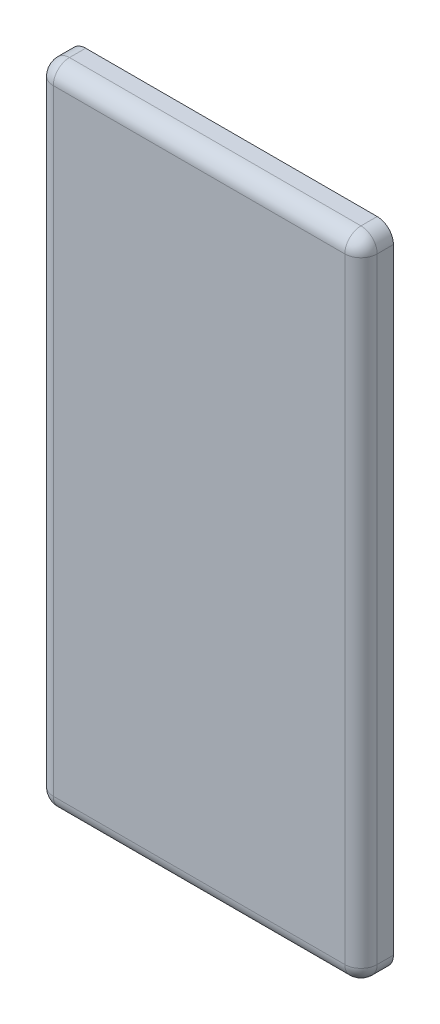
ISO-10303-21;
HEADER;
FILE_DESCRIPTION(('STEP AP214'),'2;1');
FILE_NAME('part.step','',(''),(''),'','','');
FILE_SCHEMA(('AUTOMOTIVE_DESIGN { 1 0 10303 214 1 1 1 1 }'));
ENDSEC;
DATA;
#1=APPLICATION_CONTEXT('core data for automotive mechanical design processes');
#2=APPLICATION_PROTOCOL_DEFINITION('international standard','automotive_design',2000,#1);
#3=PRODUCT_CONTEXT('',#1,'mechanical');
#4=PRODUCT('Part','Part','',(#3));
#5=PRODUCT_RELATED_PRODUCT_CATEGORY('part','',(#4));
#6=PRODUCT_DEFINITION_FORMATION('','',#4);
#7=PRODUCT_DEFINITION_CONTEXT('part definition',#1,'design');
#8=PRODUCT_DEFINITION('design','',#6,#7);
#9=PRODUCT_DEFINITION_SHAPE('','',#8);
#10=(LENGTH_UNIT() NAMED_UNIT(*) SI_UNIT(.MILLI.,.METRE.));
#11=(NAMED_UNIT(*) PLANE_ANGLE_UNIT() SI_UNIT($,.RADIAN.));
#12=(NAMED_UNIT(*) SI_UNIT($,.STERADIAN.) SOLID_ANGLE_UNIT());
#13=UNCERTAINTY_MEASURE_WITH_UNIT(LENGTH_MEASURE(1.E-05),#10,'distance_accuracy_value','');
#14=(GEOMETRIC_REPRESENTATION_CONTEXT(3) GLOBAL_UNCERTAINTY_ASSIGNED_CONTEXT((#13)) GLOBAL_UNIT_ASSIGNED_CONTEXT((#10,
#11,#12)) REPRESENTATION_CONTEXT('',''));
#15=CARTESIAN_POINT('',(0.,0.,0.));
#16=DIRECTION('',(0.,0.,1.));
#17=DIRECTION('',(1.,0.,0.));
#18=AXIS2_PLACEMENT_3D('',#15,#16,#17);
#19=CARTESIAN_POINT('',(10.,-20.,2.));
#20=DIRECTION('',(-1.,0.,0.));
#21=DIRECTION('',(0.,0.,1.));
#22=AXIS2_PLACEMENT_3D('',#19,#20,#21);
#23=PLANE('',#22);
#24=DIRECTION('',(0.,0.,-1.));
#25=VECTOR('',#24,1.);
#26=CARTESIAN_POINT('',(10.,19.,2.));
#27=LINE('',#26,#25);
#28=CARTESIAN_POINT('',(10.,19.,0.));
#29=VERTEX_POINT('',#28);
#30=CARTESIAN_POINT('',(10.,19.,1.));
#31=VERTEX_POINT('',#30);
#32=EDGE_CURVE('E153',#29,#31,#27,.F.);
#33=ORIENTED_EDGE('',*,*,#32,.T.);
#34=DIRECTION('',(0.,1.,0.));
#35=VECTOR('',#34,1.);
#36=CARTESIAN_POINT('',(10.,-20.,1.));
#37=LINE('',#36,#35);
#38=CARTESIAN_POINT('',(10.,-19.,1.));
#39=VERTEX_POINT('',#38);
#40=EDGE_CURVE('E172',#31,#39,#37,.F.);
#41=ORIENTED_EDGE('',*,*,#40,.T.);
#42=DIRECTION('',(0.,0.,-1.));
#43=VECTOR('',#42,1.);
#44=CARTESIAN_POINT('',(10.,-19.,2.));
#45=LINE('',#44,#43);
#46=CARTESIAN_POINT('',(10.,-19.,0.));
#47=VERTEX_POINT('',#46);
#48=EDGE_CURVE('E151',#39,#47,#45,.T.);
#49=ORIENTED_EDGE('',*,*,#48,.T.);
#50=DIRECTION('',(0.,1.,0.));
#51=VECTOR('',#50,1.);
#52=CARTESIAN_POINT('',(10.,-20.,0.));
#53=LINE('',#52,#51);
#54=EDGE_CURVE('E200',#47,#29,#53,.T.);
#55=ORIENTED_EDGE('',*,*,#54,.T.);
#56=EDGE_LOOP('',(#33,#41,#49,#55));
#57=FACE_BOUND('',#56,.T.);
#58=ADVANCED_FACE('F34',(#57),#23,.F.);
#59=CARTESIAN_POINT('',(-10.,20.,2.));
#60=DIRECTION('',(0.,-1.,0.));
#61=DIRECTION('',(0.,0.,-1.));
#62=AXIS2_PLACEMENT_3D('',#59,#60,#61);
#63=PLANE('',#62);
#64=DIRECTION('',(0.,0.,-1.));
#65=VECTOR('',#64,1.);
#66=CARTESIAN_POINT('',(-9.,20.,2.));
#67=LINE('',#66,#65);
#68=CARTESIAN_POINT('',(-9.,20.,0.));
#69=VERTEX_POINT('',#68);
#70=CARTESIAN_POINT('',(-9.,20.,1.));
#71=VERTEX_POINT('',#70);
#72=EDGE_CURVE('E148',#69,#71,#67,.F.);
#73=ORIENTED_EDGE('',*,*,#72,.T.);
#74=DIRECTION('',(-1.,0.,0.));
#75=VECTOR('',#74,1.);
#76=CARTESIAN_POINT('',(-10.,20.,1.));
#77=LINE('',#76,#75);
#78=CARTESIAN_POINT('',(9.,20.,1.));
#79=VERTEX_POINT('',#78);
#80=EDGE_CURVE('E168',#71,#79,#77,.F.);
#81=ORIENTED_EDGE('',*,*,#80,.T.);
#82=DIRECTION('',(0.,0.,-1.));
#83=VECTOR('',#82,1.);
#84=CARTESIAN_POINT('',(9.,20.,2.));
#85=LINE('',#84,#83);
#86=CARTESIAN_POINT('',(9.,20.,0.));
#87=VERTEX_POINT('',#86);
#88=EDGE_CURVE('E146',#79,#87,#85,.T.);
#89=ORIENTED_EDGE('',*,*,#88,.T.);
#90=DIRECTION('',(-1.,0.,0.));
#91=VECTOR('',#90,1.);
#92=CARTESIAN_POINT('',(-10.,20.,0.));
#93=LINE('',#92,#91);
#94=EDGE_CURVE('E136',#87,#69,#93,.T.);
#95=ORIENTED_EDGE('',*,*,#94,.T.);
#96=EDGE_LOOP('',(#73,#81,#89,#95));
#97=FACE_BOUND('',#96,.T.);
#98=ADVANCED_FACE('F212',(#97),#63,.F.);
#99=CARTESIAN_POINT('',(-10.,-20.,2.));
#100=DIRECTION('',(1.,0.,0.));
#101=DIRECTION('',(0.,0.,-1.));
#102=AXIS2_PLACEMENT_3D('',#99,#100,#101);
#103=PLANE('',#102);
#104=DIRECTION('',(0.,0.,-1.));
#105=VECTOR('',#104,1.);
#106=CARTESIAN_POINT('',(-10.,-19.,2.));
#107=LINE('',#106,#105);
#108=CARTESIAN_POINT('',(-10.,-19.,0.));
#109=VERTEX_POINT('',#108);
#110=CARTESIAN_POINT('',(-10.,-19.,1.));
#111=VERTEX_POINT('',#110);
#112=EDGE_CURVE('E123',#109,#111,#107,.F.);
#113=ORIENTED_EDGE('',*,*,#112,.T.);
#114=DIRECTION('',(0.,-1.,0.));
#115=VECTOR('',#114,1.);
#116=CARTESIAN_POINT('',(-10.,-20.,1.));
#117=LINE('',#116,#115);
#118=CARTESIAN_POINT('',(-10.,19.,1.));
#119=VERTEX_POINT('',#118);
#120=EDGE_CURVE('E11',#111,#119,#117,.F.);
#121=ORIENTED_EDGE('',*,*,#120,.T.);
#122=DIRECTION('',(0.,0.,-1.));
#123=VECTOR('',#122,1.);
#124=CARTESIAN_POINT('',(-10.,19.,2.));
#125=LINE('',#124,#123);
#126=CARTESIAN_POINT('',(-10.,19.,0.));
#127=VERTEX_POINT('',#126);
#128=EDGE_CURVE('E127',#119,#127,#125,.T.);
#129=ORIENTED_EDGE('',*,*,#128,.T.);
#130=DIRECTION('',(0.,-1.,0.));
#131=VECTOR('',#130,1.);
#132=CARTESIAN_POINT('',(-10.,-20.,0.));
#133=LINE('',#132,#131);
#134=EDGE_CURVE('E133',#127,#109,#133,.T.);
#135=ORIENTED_EDGE('',*,*,#134,.T.);
#136=EDGE_LOOP('',(#113,#121,#129,#135));
#137=FACE_BOUND('',#136,.T.);
#138=ADVANCED_FACE('F264',(#137),#103,.F.);
#139=CARTESIAN_POINT('',(-10.,-20.,2.));
#140=DIRECTION('',(0.,1.,0.));
#141=DIRECTION('',(0.,0.,1.));
#142=AXIS2_PLACEMENT_3D('',#139,#140,#141);
#143=PLANE('',#142);
#144=DIRECTION('',(0.,0.,-1.));
#145=VECTOR('',#144,1.);
#146=CARTESIAN_POINT('',(9.,-20.,2.));
#147=LINE('',#146,#145);
#148=CARTESIAN_POINT('',(9.,-20.,0.));
#149=VERTEX_POINT('',#148);
#150=CARTESIAN_POINT('',(9.,-20.,1.));
#151=VERTEX_POINT('',#150);
#152=EDGE_CURVE('E119',#149,#151,#147,.F.);
#153=ORIENTED_EDGE('',*,*,#152,.T.);
#154=DIRECTION('',(1.,0.,0.));
#155=VECTOR('',#154,1.);
#156=CARTESIAN_POINT('',(-10.,-20.,1.));
#157=LINE('',#156,#155);
#158=CARTESIAN_POINT('',(-9.,-20.,1.));
#159=VERTEX_POINT('',#158);
#160=EDGE_CURVE('E58',#151,#159,#157,.F.);
#161=ORIENTED_EDGE('',*,*,#160,.T.);
#162=DIRECTION('',(0.,0.,-1.));
#163=VECTOR('',#162,1.);
#164=CARTESIAN_POINT('',(-9.,-20.,2.));
#165=LINE('',#164,#163);
#166=CARTESIAN_POINT('',(-9.,-20.,0.));
#167=VERTEX_POINT('',#166);
#168=EDGE_CURVE('E111',#159,#167,#165,.T.);
#169=ORIENTED_EDGE('',*,*,#168,.T.);
#170=DIRECTION('',(1.,0.,0.));
#171=VECTOR('',#170,1.);
#172=CARTESIAN_POINT('',(-10.,-20.,0.));
#173=LINE('',#172,#171);
#174=EDGE_CURVE('E115',#167,#149,#173,.T.);
#175=ORIENTED_EDGE('',*,*,#174,.T.);
#176=EDGE_LOOP('',(#153,#161,#169,#175));
#177=FACE_BOUND('',#176,.T.);
#178=ADVANCED_FACE('F113',(#177),#143,.F.);
#179=CARTESIAN_POINT('',(0.,0.,2.));
#180=DIRECTION('',(0.,0.,-1.));
#181=DIRECTION('',(-1.,0.,0.));
#182=AXIS2_PLACEMENT_3D('',#179,#180,#181);
#183=PLANE('',#182);
#184=DIRECTION('',(0.,1.,0.));
#185=VECTOR('',#184,1.);
#186=CARTESIAN_POINT('',(9.00000000000001,0.,2.));
#187=LINE('',#186,#185);
#188=CARTESIAN_POINT('',(9.00000000000001,-19.,2.));
#189=VERTEX_POINT('',#188);
#190=CARTESIAN_POINT('',(9.00000000000001,19.,2.));
#191=VERTEX_POINT('',#190);
#192=EDGE_CURVE('E163',#189,#191,#187,.T.);
#193=ORIENTED_EDGE('',*,*,#192,.T.);
#194=DIRECTION('',(-1.,0.,0.));
#195=VECTOR('',#194,1.);
#196=CARTESIAN_POINT('',(0.,19.,2.));
#197=LINE('',#196,#195);
#198=CARTESIAN_POINT('',(-9.,19.,2.));
#199=VERTEX_POINT('',#198);
#200=EDGE_CURVE('E165',#191,#199,#197,.T.);
#201=ORIENTED_EDGE('',*,*,#200,.T.);
#202=DIRECTION('',(0.,-1.,0.));
#203=VECTOR('',#202,1.);
#204=CARTESIAN_POINT('',(-9.,0.,2.));
#205=LINE('',#204,#203);
#206=CARTESIAN_POINT('',(-9.,-19.,2.));
#207=VERTEX_POINT('',#206);
#208=EDGE_CURVE('E159',#199,#207,#205,.T.);
#209=ORIENTED_EDGE('',*,*,#208,.T.);
#210=DIRECTION('',(1.,0.,0.));
#211=VECTOR('',#210,1.);
#212=CARTESIAN_POINT('',(0.,-19.,2.));
#213=LINE('',#212,#211);
#214=EDGE_CURVE('E161',#207,#189,#213,.T.);
#215=ORIENTED_EDGE('',*,*,#214,.T.);
#216=EDGE_LOOP('',(#193,#201,#209,#215));
#217=FACE_BOUND('',#216,.T.);
#218=ADVANCED_FACE('F232',(#217),#183,.F.);
#219=CARTESIAN_POINT('',(0.,0.,0.));
#220=DIRECTION('',(0.,0.,-1.));
#221=DIRECTION('',(-1.,0.,0.));
#222=AXIS2_PLACEMENT_3D('',#219,#220,#221);
#223=PLANE('',#222);
#224=ORIENTED_EDGE('',*,*,#174,.F.);
#225=CARTESIAN_POINT('',(-9.,-19.,0.));
#226=DIRECTION('',(0.,0.,-1.));
#227=DIRECTION('',(-1.,0.,0.));
#228=AXIS2_PLACEMENT_3D('',#225,#226,#227);
#229=CIRCLE('',#228,1.);
#230=EDGE_CURVE('E121',#167,#109,#229,.T.);
#231=ORIENTED_EDGE('',*,*,#230,.T.);
#232=ORIENTED_EDGE('',*,*,#134,.F.);
#233=CARTESIAN_POINT('',(-9.,19.,0.));
#234=DIRECTION('',(0.,0.,-1.));
#235=DIRECTION('',(-1.,0.,0.));
#236=AXIS2_PLACEMENT_3D('',#233,#234,#235);
#237=CIRCLE('',#236,1.);
#238=EDGE_CURVE('E128',#127,#69,#237,.T.);
#239=ORIENTED_EDGE('',*,*,#238,.T.);
#240=ORIENTED_EDGE('',*,*,#94,.F.);
#241=CARTESIAN_POINT('',(9.,19.,0.));
#242=DIRECTION('',(0.,0.,-1.));
#243=DIRECTION('',(-1.,0.,0.));
#244=AXIS2_PLACEMENT_3D('',#241,#242,#243);
#245=CIRCLE('',#244,1.);
#246=EDGE_CURVE('E141',#87,#29,#245,.T.);
#247=ORIENTED_EDGE('',*,*,#246,.T.);
#248=ORIENTED_EDGE('',*,*,#54,.F.);
#249=CARTESIAN_POINT('',(9.00000000000001,-19.,0.));
#250=DIRECTION('',(0.,0.,-1.));
#251=DIRECTION('',(-1.,0.,0.));
#252=AXIS2_PLACEMENT_3D('',#249,#250,#251);
#253=CIRCLE('',#252,1.);
#254=EDGE_CURVE('E118',#47,#149,#253,.T.);
#255=ORIENTED_EDGE('',*,*,#254,.T.);
#256=EDGE_LOOP('',(#224,#231,#232,#239,#240,#247,#248,#255));
#257=FACE_BOUND('',#256,.T.);
#258=ADVANCED_FACE('F130',(#257),#223,.T.);
#259=CARTESIAN_POINT('',(-9.,-19.,2.));
#260=DIRECTION('',(0.,0.,-1.));
#261=DIRECTION('',(-1.,0.,0.));
#262=AXIS2_PLACEMENT_3D('',#259,#260,#261);
#263=CYLINDRICAL_SURFACE('',#262,1.);
#264=ORIENTED_EDGE('',*,*,#168,.F.);
#265=CARTESIAN_POINT('',(-9.,-19.,1.));
#266=DIRECTION('',(0.,0.,-1.));
#267=DIRECTION('',(-1.,0.,0.));
#268=AXIS2_PLACEMENT_3D('',#265,#266,#267);
#269=CIRCLE('',#268,1.);
#270=EDGE_CURVE('E43',#159,#111,#269,.T.);
#271=ORIENTED_EDGE('',*,*,#270,.T.);
#272=ORIENTED_EDGE('',*,*,#112,.F.);
#273=ORIENTED_EDGE('',*,*,#230,.F.);
#274=EDGE_LOOP('',(#264,#271,#272,#273));
#275=FACE_BOUND('',#274,.T.);
#276=ADVANCED_FACE('F122',(#275),#263,.T.);
#277=CARTESIAN_POINT('',(-9.,19.,2.));
#278=DIRECTION('',(0.,0.,-1.));
#279=DIRECTION('',(-1.,0.,0.));
#280=AXIS2_PLACEMENT_3D('',#277,#278,#279);
#281=CYLINDRICAL_SURFACE('',#280,1.);
#282=ORIENTED_EDGE('',*,*,#128,.F.);
#283=CARTESIAN_POINT('',(-9.,19.,1.));
#284=DIRECTION('',(0.,0.,-1.));
#285=DIRECTION('',(-1.,0.,0.));
#286=AXIS2_PLACEMENT_3D('',#283,#284,#285);
#287=CIRCLE('',#286,1.);
#288=EDGE_CURVE('E156',#119,#71,#287,.T.);
#289=ORIENTED_EDGE('',*,*,#288,.T.);
#290=ORIENTED_EDGE('',*,*,#72,.F.);
#291=ORIENTED_EDGE('',*,*,#238,.F.);
#292=EDGE_LOOP('',(#282,#289,#290,#291));
#293=FACE_BOUND('',#292,.T.);
#294=ADVANCED_FACE('F218',(#293),#281,.T.);
#295=CARTESIAN_POINT('',(9.,19.,2.));
#296=DIRECTION('',(0.,0.,-1.));
#297=DIRECTION('',(-1.,0.,0.));
#298=AXIS2_PLACEMENT_3D('',#295,#296,#297);
#299=CYLINDRICAL_SURFACE('',#298,1.);
#300=ORIENTED_EDGE('',*,*,#88,.F.);
#301=CARTESIAN_POINT('',(9.,19.,1.));
#302=DIRECTION('',(0.,0.,-1.));
#303=DIRECTION('',(-1.,0.,0.));
#304=AXIS2_PLACEMENT_3D('',#301,#302,#303);
#305=CIRCLE('',#304,1.);
#306=EDGE_CURVE('E170',#79,#31,#305,.T.);
#307=ORIENTED_EDGE('',*,*,#306,.T.);
#308=ORIENTED_EDGE('',*,*,#32,.F.);
#309=ORIENTED_EDGE('',*,*,#246,.F.);
#310=EDGE_LOOP('',(#300,#307,#308,#309));
#311=FACE_BOUND('',#310,.T.);
#312=ADVANCED_FACE('F239',(#311),#299,.T.);
#313=CARTESIAN_POINT('',(9.00000000000001,-19.,2.));
#314=DIRECTION('',(0.,0.,-1.));
#315=DIRECTION('',(-1.,0.,0.));
#316=AXIS2_PLACEMENT_3D('',#313,#314,#315);
#317=CYLINDRICAL_SURFACE('',#316,1.);
#318=ORIENTED_EDGE('',*,*,#48,.F.);
#319=CARTESIAN_POINT('',(9.00000000000001,-19.,1.));
#320=DIRECTION('',(0.,0.,-1.));
#321=DIRECTION('',(-1.,0.,0.));
#322=AXIS2_PLACEMENT_3D('',#319,#320,#321);
#323=CIRCLE('',#322,1.);
#324=EDGE_CURVE('E174',#39,#151,#323,.T.);
#325=ORIENTED_EDGE('',*,*,#324,.T.);
#326=ORIENTED_EDGE('',*,*,#152,.F.);
#327=ORIENTED_EDGE('',*,*,#254,.F.);
#328=EDGE_LOOP('',(#318,#325,#326,#327));
#329=FACE_BOUND('',#328,.T.);
#330=ADVANCED_FACE('F246',(#329),#317,.T.);
#331=CARTESIAN_POINT('',(9.00000000000001,-19.,1.));
#332=DIRECTION('',(0.,0.,-1.));
#333=DIRECTION('',(-1.,0.,0.));
#334=AXIS2_PLACEMENT_3D('',#331,#332,#333);
#335=SPHERICAL_SURFACE('',#334,1.);
#336=CARTESIAN_POINT('',(9.00000000000001,-19.,1.));
#337=DIRECTION('',(-1.,0.,0.));
#338=DIRECTION('',(0.,-1.,0.));
#339=AXIS2_PLACEMENT_3D('',#336,#337,#338);
#340=CIRCLE('',#339,1.);
#341=EDGE_CURVE('E193',#151,#189,#340,.T.);
#342=ORIENTED_EDGE('',*,*,#341,.F.);
#343=ORIENTED_EDGE('',*,*,#324,.F.);
#344=CARTESIAN_POINT('',(9.00000000000001,-19.,1.));
#345=DIRECTION('',(0.,1.,0.));
#346=DIRECTION('',(0.,0.,1.));
#347=AXIS2_PLACEMENT_3D('',#344,#345,#346);
#348=CIRCLE('',#347,1.);
#349=EDGE_CURVE('E38',#189,#39,#348,.T.);
#350=ORIENTED_EDGE('',*,*,#349,.F.);
#351=EDGE_LOOP('',(#342,#343,#350));
#352=FACE_BOUND('',#351,.T.);
#353=ADVANCED_FACE('F36',(#352),#335,.T.);
#354=CARTESIAN_POINT('',(9.00000000000001,0.,1.));
#355=DIRECTION('',(0.,1.,0.));
#356=DIRECTION('',(0.,0.,1.));
#357=AXIS2_PLACEMENT_3D('',#354,#355,#356);
#358=CYLINDRICAL_SURFACE('',#357,1.);
#359=ORIENTED_EDGE('',*,*,#349,.T.);
#360=ORIENTED_EDGE('',*,*,#40,.F.);
#361=CARTESIAN_POINT('',(9.00000000000001,19.,1.));
#362=DIRECTION('',(0.,1.,0.));
#363=DIRECTION('',(0.,0.,1.));
#364=AXIS2_PLACEMENT_3D('',#361,#362,#363);
#365=CIRCLE('',#364,1.);
#366=EDGE_CURVE('E191',#191,#31,#365,.T.);
#367=ORIENTED_EDGE('',*,*,#366,.F.);
#368=ORIENTED_EDGE('',*,*,#192,.F.);
#369=EDGE_LOOP('',(#359,#360,#367,#368));
#370=FACE_BOUND('',#369,.T.);
#371=ADVANCED_FACE('F242',(#370),#358,.T.);
#372=CARTESIAN_POINT('',(0.,-19.,1.));
#373=DIRECTION('',(1.,0.,0.));
#374=DIRECTION('',(0.,0.,-1.));
#375=AXIS2_PLACEMENT_3D('',#372,#373,#374);
#376=CYLINDRICAL_SURFACE('',#375,1.);
#377=ORIENTED_EDGE('',*,*,#341,.T.);
#378=ORIENTED_EDGE('',*,*,#214,.F.);
#379=CARTESIAN_POINT('',(-9.,-19.,1.));
#380=DIRECTION('',(-1.,0.,0.));
#381=DIRECTION('',(0.,0.,1.));
#382=AXIS2_PLACEMENT_3D('',#379,#380,#381);
#383=CIRCLE('',#382,1.);
#384=EDGE_CURVE('E188',#159,#207,#383,.T.);
#385=ORIENTED_EDGE('',*,*,#384,.F.);
#386=ORIENTED_EDGE('',*,*,#160,.F.);
#387=EDGE_LOOP('',(#377,#378,#385,#386));
#388=FACE_BOUND('',#387,.T.);
#389=ADVANCED_FACE('F248',(#388),#376,.T.);
#390=CARTESIAN_POINT('',(9.,19.,1.));
#391=DIRECTION('',(0.,0.,-1.));
#392=DIRECTION('',(-1.,0.,0.));
#393=AXIS2_PLACEMENT_3D('',#390,#391,#392);
#394=SPHERICAL_SURFACE('',#393,1.);
#395=ORIENTED_EDGE('',*,*,#366,.T.);
#396=ORIENTED_EDGE('',*,*,#306,.F.);
#397=CARTESIAN_POINT('',(9.,19.,1.));
#398=DIRECTION('',(-1.,0.,0.));
#399=DIRECTION('',(0.,0.,1.));
#400=AXIS2_PLACEMENT_3D('',#397,#398,#399);
#401=CIRCLE('',#400,1.);
#402=EDGE_CURVE('E185',#191,#79,#401,.T.);
#403=ORIENTED_EDGE('',*,*,#402,.F.);
#404=EDGE_LOOP('',(#395,#396,#403));
#405=FACE_BOUND('',#404,.T.);
#406=ADVANCED_FACE('F241',(#405),#394,.T.);
#407=CARTESIAN_POINT('',(-9.,-19.,1.));
#408=DIRECTION('',(0.,0.,-1.));
#409=DIRECTION('',(-1.,0.,0.));
#410=AXIS2_PLACEMENT_3D('',#407,#408,#409);
#411=SPHERICAL_SURFACE('',#410,1.);
#412=ORIENTED_EDGE('',*,*,#270,.F.);
#413=ORIENTED_EDGE('',*,*,#384,.T.);
#414=CARTESIAN_POINT('',(-9.,-19.,1.));
#415=DIRECTION('',(0.,1.,0.));
#416=DIRECTION('',(0.,0.,1.));
#417=AXIS2_PLACEMENT_3D('',#414,#415,#416);
#418=CIRCLE('',#417,1.);
#419=EDGE_CURVE('E182',#111,#207,#418,.T.);
#420=ORIENTED_EDGE('',*,*,#419,.F.);
#421=EDGE_LOOP('',(#412,#413,#420));
#422=FACE_BOUND('',#421,.T.);
#423=ADVANCED_FACE('F250',(#422),#411,.T.);
#424=CARTESIAN_POINT('',(0.,19.,1.));
#425=DIRECTION('',(-1.,0.,0.));
#426=DIRECTION('',(0.,0.,1.));
#427=AXIS2_PLACEMENT_3D('',#424,#425,#426);
#428=CYLINDRICAL_SURFACE('',#427,1.);
#429=ORIENTED_EDGE('',*,*,#402,.T.);
#430=ORIENTED_EDGE('',*,*,#80,.F.);
#431=CARTESIAN_POINT('',(-9.,19.,1.));
#432=DIRECTION('',(-1.,0.,0.));
#433=DIRECTION('',(0.,0.,1.));
#434=AXIS2_PLACEMENT_3D('',#431,#432,#433);
#435=CIRCLE('',#434,1.);
#436=EDGE_CURVE('E180',#199,#71,#435,.T.);
#437=ORIENTED_EDGE('',*,*,#436,.F.);
#438=ORIENTED_EDGE('',*,*,#200,.F.);
#439=EDGE_LOOP('',(#429,#430,#437,#438));
#440=FACE_BOUND('',#439,.T.);
#441=ADVANCED_FACE('F235',(#440),#428,.T.);
#442=CARTESIAN_POINT('',(-9.,0.,1.));
#443=DIRECTION('',(0.,-1.,0.));
#444=DIRECTION('',(0.,0.,-1.));
#445=AXIS2_PLACEMENT_3D('',#442,#443,#444);
#446=CYLINDRICAL_SURFACE('',#445,1.);
#447=ORIENTED_EDGE('',*,*,#419,.T.);
#448=ORIENTED_EDGE('',*,*,#208,.F.);
#449=CARTESIAN_POINT('',(-9.,19.,1.));
#450=DIRECTION('',(0.,1.,0.));
#451=DIRECTION('',(0.,0.,1.));
#452=AXIS2_PLACEMENT_3D('',#449,#450,#451);
#453=CIRCLE('',#452,1.);
#454=EDGE_CURVE('E178',#119,#199,#453,.T.);
#455=ORIENTED_EDGE('',*,*,#454,.F.);
#456=ORIENTED_EDGE('',*,*,#120,.F.);
#457=EDGE_LOOP('',(#447,#448,#455,#456));
#458=FACE_BOUND('',#457,.T.);
#459=ADVANCED_FACE('F228',(#458),#446,.T.);
#460=CARTESIAN_POINT('',(-9.,19.,1.));
#461=DIRECTION('',(0.,0.,-1.));
#462=DIRECTION('',(-1.,0.,0.));
#463=AXIS2_PLACEMENT_3D('',#460,#461,#462);
#464=SPHERICAL_SURFACE('',#463,1.);
#465=ORIENTED_EDGE('',*,*,#436,.T.);
#466=ORIENTED_EDGE('',*,*,#288,.F.);
#467=ORIENTED_EDGE('',*,*,#454,.T.);
#468=EDGE_LOOP('',(#465,#466,#467));
#469=FACE_BOUND('',#468,.T.);
#470=ADVANCED_FACE('F222',(#469),#464,.T.);
#471=CLOSED_SHELL('',(#58,#98,#138,#178,#218,#258,#276,#294,#312,#330,#353,#371,#389,#406,#423,
#441,#459,#470));
#472=MANIFOLD_SOLID_BREP('B2',#471);
#473=ADVANCED_BREP_SHAPE_REPRESENTATION('',(#18,#472),#14);
#474=SHAPE_DEFINITION_REPRESENTATION(#9,#473);
ENDSEC;
END-ISO-10303-21;
